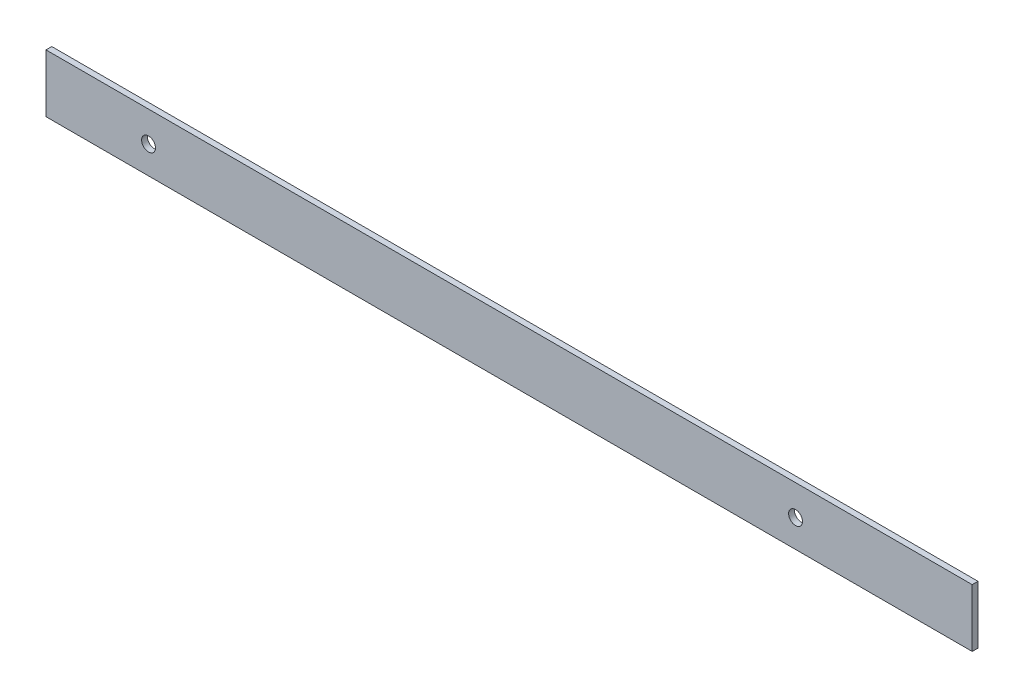
ISO-10303-21;
HEADER;
FILE_DESCRIPTION(('STEP AP214'),'2;1');
FILE_NAME('part.step','',(''),(''),'','','');
FILE_SCHEMA(('AUTOMOTIVE_DESIGN { 1 0 10303 214 1 1 1 1 }'));
ENDSEC;
DATA;
#1=APPLICATION_CONTEXT('core data for automotive mechanical design processes');
#2=APPLICATION_PROTOCOL_DEFINITION('international standard','automotive_design',2000,#1);
#3=PRODUCT_CONTEXT('',#1,'mechanical');
#4=PRODUCT('Part','Part','',(#3));
#5=PRODUCT_RELATED_PRODUCT_CATEGORY('part','',(#4));
#6=PRODUCT_DEFINITION_FORMATION('','',#4);
#7=PRODUCT_DEFINITION_CONTEXT('part definition',#1,'design');
#8=PRODUCT_DEFINITION('design','',#6,#7);
#9=PRODUCT_DEFINITION_SHAPE('','',#8);
#10=(LENGTH_UNIT() NAMED_UNIT(*) SI_UNIT(.MILLI.,.METRE.));
#11=(NAMED_UNIT(*) PLANE_ANGLE_UNIT() SI_UNIT($,.RADIAN.));
#12=(NAMED_UNIT(*) SI_UNIT($,.STERADIAN.) SOLID_ANGLE_UNIT());
#13=UNCERTAINTY_MEASURE_WITH_UNIT(LENGTH_MEASURE(1.E-05),#10,'distance_accuracy_value','');
#14=(GEOMETRIC_REPRESENTATION_CONTEXT(3) GLOBAL_UNCERTAINTY_ASSIGNED_CONTEXT((#13)) GLOBAL_UNIT_ASSIGNED_CONTEXT((#10,
#11,#12)) REPRESENTATION_CONTEXT('',''));
#15=CARTESIAN_POINT('',(0.,0.,0.));
#16=DIRECTION('',(0.,0.,1.));
#17=DIRECTION('',(1.,0.,0.));
#18=AXIS2_PLACEMENT_3D('',#15,#16,#17);
#19=CARTESIAN_POINT('',(0.,50.,5.));
#20=DIRECTION('',(0.,1.,0.));
#21=DIRECTION('',(0.,0.,1.));
#22=AXIS2_PLACEMENT_3D('',#19,#20,#21);
#23=PLANE('',#22);
#24=DIRECTION('',(1.,0.,0.));
#25=VECTOR('',#24,1.);
#26=CARTESIAN_POINT('',(0.,50.,0.));
#27=LINE('',#26,#25);
#28=CARTESIAN_POINT('',(0.,50.,0.));
#29=VERTEX_POINT('',#28);
#30=CARTESIAN_POINT('',(800.,50.,0.));
#31=VERTEX_POINT('',#30);
#32=EDGE_CURVE('E116',#29,#31,#27,.T.);
#33=ORIENTED_EDGE('',*,*,#32,.F.);
#34=DIRECTION('',(0.,0.,-1.));
#35=VECTOR('',#34,1.);
#36=CARTESIAN_POINT('',(0.,50.,5.));
#37=LINE('',#36,#35);
#38=CARTESIAN_POINT('',(0.,50.,5.));
#39=VERTEX_POINT('',#38);
#40=EDGE_CURVE('E11',#39,#29,#37,.T.);
#41=ORIENTED_EDGE('',*,*,#40,.F.);
#42=DIRECTION('',(1.,0.,0.));
#43=VECTOR('',#42,1.);
#44=CARTESIAN_POINT('',(0.,50.,5.));
#45=LINE('',#44,#43);
#46=CARTESIAN_POINT('',(800.,50.,5.));
#47=VERTEX_POINT('',#46);
#48=EDGE_CURVE('E101',#39,#47,#45,.T.);
#49=ORIENTED_EDGE('',*,*,#48,.T.);
#50=DIRECTION('',(0.,0.,-1.));
#51=VECTOR('',#50,1.);
#52=CARTESIAN_POINT('',(800.,50.,5.));
#53=LINE('',#52,#51);
#54=EDGE_CURVE('E78',#47,#31,#53,.T.);
#55=ORIENTED_EDGE('',*,*,#54,.T.);
#56=EDGE_LOOP('',(#33,#41,#49,#55));
#57=FACE_BOUND('',#56,.T.);
#58=ADVANCED_FACE('F38',(#57),#23,.T.);
#59=CARTESIAN_POINT('',(0.,0.,5.));
#60=DIRECTION('',(-1.,0.,0.));
#61=DIRECTION('',(0.,0.,1.));
#62=AXIS2_PLACEMENT_3D('',#59,#60,#61);
#63=PLANE('',#62);
#64=DIRECTION('',(0.,1.,0.));
#65=VECTOR('',#64,1.);
#66=CARTESIAN_POINT('',(0.,0.,0.));
#67=LINE('',#66,#65);
#68=CARTESIAN_POINT('',(0.,0.,0.));
#69=VERTEX_POINT('',#68);
#70=EDGE_CURVE('E90',#69,#29,#67,.T.);
#71=ORIENTED_EDGE('',*,*,#70,.F.);
#72=DIRECTION('',(0.,0.,-1.));
#73=VECTOR('',#72,1.);
#74=CARTESIAN_POINT('',(0.,0.,5.));
#75=LINE('',#74,#73);
#76=CARTESIAN_POINT('',(0.,0.,5.));
#77=VERTEX_POINT('',#76);
#78=EDGE_CURVE('E47',#77,#69,#75,.T.);
#79=ORIENTED_EDGE('',*,*,#78,.F.);
#80=DIRECTION('',(0.,1.,0.));
#81=VECTOR('',#80,1.);
#82=CARTESIAN_POINT('',(0.,0.,5.));
#83=LINE('',#82,#81);
#84=EDGE_CURVE('E88',#77,#39,#83,.T.);
#85=ORIENTED_EDGE('',*,*,#84,.T.);
#86=ORIENTED_EDGE('',*,*,#40,.T.);
#87=EDGE_LOOP('',(#71,#79,#85,#86));
#88=FACE_BOUND('',#87,.T.);
#89=ADVANCED_FACE('F86',(#88),#63,.T.);
#90=CARTESIAN_POINT('',(0.,0.,5.));
#91=DIRECTION('',(0.,1.,0.));
#92=DIRECTION('',(0.,0.,1.));
#93=AXIS2_PLACEMENT_3D('',#90,#91,#92);
#94=PLANE('',#93);
#95=DIRECTION('',(1.,0.,0.));
#96=VECTOR('',#95,1.);
#97=CARTESIAN_POINT('',(0.,0.,0.));
#98=LINE('',#97,#96);
#99=CARTESIAN_POINT('',(800.,0.,0.));
#100=VERTEX_POINT('',#99);
#101=EDGE_CURVE('E120',#69,#100,#98,.T.);
#102=ORIENTED_EDGE('',*,*,#101,.T.);
#103=DIRECTION('',(0.,0.,-1.));
#104=VECTOR('',#103,1.);
#105=CARTESIAN_POINT('',(800.,0.,5.));
#106=LINE('',#105,#104);
#107=CARTESIAN_POINT('',(800.,0.,5.));
#108=VERTEX_POINT('',#107);
#109=EDGE_CURVE('E93',#108,#100,#106,.T.);
#110=ORIENTED_EDGE('',*,*,#109,.F.);
#111=DIRECTION('',(1.,0.,0.));
#112=VECTOR('',#111,1.);
#113=CARTESIAN_POINT('',(0.,0.,5.));
#114=LINE('',#113,#112);
#115=EDGE_CURVE('E95',#77,#108,#114,.T.);
#116=ORIENTED_EDGE('',*,*,#115,.F.);
#117=ORIENTED_EDGE('',*,*,#78,.T.);
#118=EDGE_LOOP('',(#102,#110,#116,#117));
#119=FACE_BOUND('',#118,.T.);
#120=ADVANCED_FACE('F96',(#119),#94,.F.);
#121=CARTESIAN_POINT('',(800.,0.,5.));
#122=DIRECTION('',(-1.,0.,0.));
#123=DIRECTION('',(0.,0.,1.));
#124=AXIS2_PLACEMENT_3D('',#121,#122,#123);
#125=PLANE('',#124);
#126=DIRECTION('',(0.,1.,0.));
#127=VECTOR('',#126,1.);
#128=CARTESIAN_POINT('',(800.,0.,0.));
#129=LINE('',#128,#127);
#130=EDGE_CURVE('E71',#100,#31,#129,.T.);
#131=ORIENTED_EDGE('',*,*,#130,.T.);
#132=ORIENTED_EDGE('',*,*,#54,.F.);
#133=DIRECTION('',(0.,1.,0.));
#134=VECTOR('',#133,1.);
#135=CARTESIAN_POINT('',(800.,0.,5.));
#136=LINE('',#135,#134);
#137=EDGE_CURVE('E55',#108,#47,#136,.T.);
#138=ORIENTED_EDGE('',*,*,#137,.F.);
#139=ORIENTED_EDGE('',*,*,#109,.T.);
#140=EDGE_LOOP('',(#131,#132,#138,#139));
#141=FACE_BOUND('',#140,.T.);
#142=ADVANCED_FACE('F130',(#141),#125,.F.);
#143=CARTESIAN_POINT('',(88.5628718775445,23.8811411781323,5.));
#144=DIRECTION('',(0.,0.,-1.));
#145=DIRECTION('',(-1.,0.,0.));
#146=AXIS2_PLACEMENT_3D('',#143,#144,#145);
#147=CYLINDRICAL_SURFACE('',#146,6.00000000000002);
#148=CARTESIAN_POINT('',(88.5628718775445,23.8811411781323,5.));
#149=DIRECTION('',(0.,0.,1.));
#150=DIRECTION('',(1.,0.,0.));
#151=AXIS2_PLACEMENT_3D('',#148,#149,#150);
#152=CIRCLE('',#151,6.00000000000002);
#153=CARTESIAN_POINT('',(94.5628718775445,23.8811411781323,5.));
#154=VERTEX_POINT('',#153);
#155=EDGE_CURVE('E104',#154,#154,#152,.T.);
#156=ORIENTED_EDGE('',*,*,#155,.T.);
#157=EDGE_LOOP('',(#156));
#158=FACE_BOUND('',#157,.T.);
#159=CARTESIAN_POINT('',(88.5628718775445,23.8811411781323,0.));
#160=DIRECTION('',(0.,0.,1.));
#161=DIRECTION('',(1.,0.,0.));
#162=AXIS2_PLACEMENT_3D('',#159,#160,#161);
#163=CIRCLE('',#162,6.00000000000002);
#164=CARTESIAN_POINT('',(94.5628718775445,23.8811411781323,0.));
#165=VERTEX_POINT('',#164);
#166=EDGE_CURVE('E113',#165,#165,#163,.T.);
#167=ORIENTED_EDGE('',*,*,#166,.F.);
#168=EDGE_LOOP('',(#167));
#169=FACE_BOUND('',#168,.T.);
#170=ADVANCED_FACE('F40',(#158,#169),#147,.F.);
#171=CARTESIAN_POINT('',(647.412196041836,23.8811411781326,5.));
#172=DIRECTION('',(0.,0.,-1.));
#173=DIRECTION('',(-1.,0.,0.));
#174=AXIS2_PLACEMENT_3D('',#171,#172,#173);
#175=CYLINDRICAL_SURFACE('',#174,5.99999999999999);
#176=CARTESIAN_POINT('',(647.412196041836,23.8811411781326,5.));
#177=DIRECTION('',(0.,0.,1.));
#178=DIRECTION('',(1.,0.,0.));
#179=AXIS2_PLACEMENT_3D('',#176,#177,#178);
#180=CIRCLE('',#179,5.99999999999999);
#181=CARTESIAN_POINT('',(653.412196041836,23.8811411781326,5.));
#182=VERTEX_POINT('',#181);
#183=EDGE_CURVE('E109',#182,#182,#180,.T.);
#184=ORIENTED_EDGE('',*,*,#183,.T.);
#185=EDGE_LOOP('',(#184));
#186=FACE_BOUND('',#185,.T.);
#187=CARTESIAN_POINT('',(647.412196041836,23.8811411781326,0.));
#188=DIRECTION('',(0.,0.,1.));
#189=DIRECTION('',(1.,0.,0.));
#190=AXIS2_PLACEMENT_3D('',#187,#188,#189);
#191=CIRCLE('',#190,5.99999999999999);
#192=CARTESIAN_POINT('',(653.412196041836,23.8811411781326,0.));
#193=VERTEX_POINT('',#192);
#194=EDGE_CURVE('E124',#193,#193,#191,.T.);
#195=ORIENTED_EDGE('',*,*,#194,.F.);
#196=EDGE_LOOP('',(#195));
#197=FACE_BOUND('',#196,.T.);
#198=ADVANCED_FACE('F143',(#186,#197),#175,.F.);
#199=CARTESIAN_POINT('',(0.,0.,5.));
#200=DIRECTION('',(0.,0.,1.));
#201=DIRECTION('',(1.,0.,0.));
#202=AXIS2_PLACEMENT_3D('',#199,#200,#201);
#203=PLANE('',#202);
#204=ORIENTED_EDGE('',*,*,#155,.F.);
#205=EDGE_LOOP('',(#204));
#206=FACE_BOUND('',#205,.T.);
#207=ORIENTED_EDGE('',*,*,#48,.F.);
#208=ORIENTED_EDGE('',*,*,#84,.F.);
#209=ORIENTED_EDGE('',*,*,#115,.T.);
#210=ORIENTED_EDGE('',*,*,#137,.T.);
#211=EDGE_LOOP('',(#207,#208,#209,#210));
#212=FACE_BOUND('',#211,.T.);
#213=ORIENTED_EDGE('',*,*,#183,.F.);
#214=EDGE_LOOP('',(#213));
#215=FACE_BOUND('',#214,.T.);
#216=ADVANCED_FACE('F99',(#206,#212,#215),#203,.T.);
#217=CARTESIAN_POINT('',(0.,0.,0.));
#218=DIRECTION('',(0.,0.,1.));
#219=DIRECTION('',(1.,0.,0.));
#220=AXIS2_PLACEMENT_3D('',#217,#218,#219);
#221=PLANE('',#220);
#222=ORIENTED_EDGE('',*,*,#166,.T.);
#223=EDGE_LOOP('',(#222));
#224=FACE_BOUND('',#223,.T.);
#225=ORIENTED_EDGE('',*,*,#32,.T.);
#226=ORIENTED_EDGE('',*,*,#130,.F.);
#227=ORIENTED_EDGE('',*,*,#101,.F.);
#228=ORIENTED_EDGE('',*,*,#70,.T.);
#229=EDGE_LOOP('',(#225,#226,#227,#228));
#230=FACE_BOUND('',#229,.T.);
#231=ORIENTED_EDGE('',*,*,#194,.T.);
#232=EDGE_LOOP('',(#231));
#233=FACE_BOUND('',#232,.T.);
#234=ADVANCED_FACE('F131',(#224,#230,#233),#221,.F.);
#235=CLOSED_SHELL('',(#58,#89,#120,#142,#170,#198,#216,#234));
#236=MANIFOLD_SOLID_BREP('B2',#235);
#237=ADVANCED_BREP_SHAPE_REPRESENTATION('',(#18,#236),#14);
#238=SHAPE_DEFINITION_REPRESENTATION(#9,#237);
ENDSEC;
END-ISO-10303-21;
